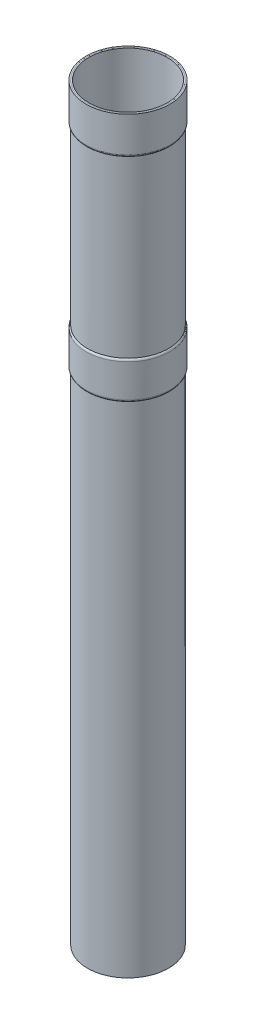
ISO-10303-21;
HEADER;
FILE_DESCRIPTION(('STEP AP214'),'2;1');
FILE_NAME('part.step','',(''),(''),'','','');
FILE_SCHEMA(('AUTOMOTIVE_DESIGN { 1 0 10303 214 1 1 1 1 }'));
ENDSEC;
DATA;
#1=APPLICATION_CONTEXT('core data for automotive mechanical design processes');
#2=APPLICATION_PROTOCOL_DEFINITION('international standard','automotive_design',2000,#1);
#3=PRODUCT_CONTEXT('',#1,'mechanical');
#4=PRODUCT('Part','Part','',(#3));
#5=PRODUCT_RELATED_PRODUCT_CATEGORY('part','',(#4));
#6=PRODUCT_DEFINITION_FORMATION('','',#4);
#7=PRODUCT_DEFINITION_CONTEXT('part definition',#1,'design');
#8=PRODUCT_DEFINITION('design','',#6,#7);
#9=PRODUCT_DEFINITION_SHAPE('','',#8);
#10=(LENGTH_UNIT() NAMED_UNIT(*) SI_UNIT(.MILLI.,.METRE.));
#11=(NAMED_UNIT(*) PLANE_ANGLE_UNIT() SI_UNIT($,.RADIAN.));
#12=(NAMED_UNIT(*) SI_UNIT($,.STERADIAN.) SOLID_ANGLE_UNIT());
#13=UNCERTAINTY_MEASURE_WITH_UNIT(LENGTH_MEASURE(1.E-05),#10,'distance_accuracy_value','');
#14=(GEOMETRIC_REPRESENTATION_CONTEXT(3) GLOBAL_UNCERTAINTY_ASSIGNED_CONTEXT((#13)) GLOBAL_UNIT_ASSIGNED_CONTEXT((#10,
#11,#12)) REPRESENTATION_CONTEXT('',''));
#15=CARTESIAN_POINT('',(0.,0.,0.));
#16=DIRECTION('',(0.,0.,1.));
#17=DIRECTION('',(1.,0.,0.));
#18=AXIS2_PLACEMENT_3D('',#15,#16,#17);
#19=CARTESIAN_POINT('',(0.,570.,0.));
#20=DIRECTION('',(0.,1.,0.));
#21=DIRECTION('',(0.,0.,1.));
#22=AXIS2_PLACEMENT_3D('',#19,#20,#21);
#23=CYLINDRICAL_SURFACE('',#22,33.5);
#24=CARTESIAN_POINT('',(0.,571.732050807569,0.));
#25=DIRECTION('',(0.,-1.,0.));
#26=DIRECTION('',(0.,0.,-1.));
#27=AXIS2_PLACEMENT_3D('',#24,#25,#26);
#28=CIRCLE('',#27,33.5);
#29=CARTESIAN_POINT('',(0.,571.732050807569,-33.5));
#30=VERTEX_POINT('',#29);
#31=EDGE_CURVE('E12',#30,#30,#28,.F.);
#32=ORIENTED_EDGE('',*,*,#31,.T.);
#33=EDGE_LOOP('',(#32));
#34=FACE_BOUND('',#33,.T.);
#35=CARTESIAN_POINT('',(0.,600.,0.));
#36=DIRECTION('',(0.,1.,0.));
#37=DIRECTION('',(0.,0.,1.));
#38=AXIS2_PLACEMENT_3D('',#35,#36,#37);
#39=CIRCLE('',#38,33.5);
#40=CARTESIAN_POINT('',(0.,600.,33.5));
#41=VERTEX_POINT('',#40);
#42=EDGE_CURVE('E57',#41,#41,#39,.T.);
#43=ORIENTED_EDGE('',*,*,#42,.F.);
#44=EDGE_LOOP('',(#43));
#45=FACE_BOUND('',#44,.T.);
#46=ADVANCED_FACE('F50',(#34,#45),#23,.T.);
#47=CARTESIAN_POINT('',(0.,600.,0.));
#48=DIRECTION('',(0.,1.,0.));
#49=DIRECTION('',(0.,0.,1.));
#50=AXIS2_PLACEMENT_3D('',#47,#48,#49);
#51=PLANE('',#50);
#52=CARTESIAN_POINT('',(0.,600.,0.));
#53=DIRECTION('',(0.,1.,0.));
#54=DIRECTION('',(0.,0.,1.));
#55=AXIS2_PLACEMENT_3D('',#52,#53,#54);
#56=CIRCLE('',#55,32.5);
#57=CARTESIAN_POINT('',(0.,600.,32.5));
#58=VERTEX_POINT('',#57);
#59=EDGE_CURVE('E65',#58,#58,#56,.T.);
#60=ORIENTED_EDGE('',*,*,#59,.F.);
#61=EDGE_LOOP('',(#60));
#62=FACE_BOUND('',#61,.T.);
#63=ORIENTED_EDGE('',*,*,#42,.T.);
#64=EDGE_LOOP('',(#63));
#65=FACE_BOUND('',#64,.T.);
#66=ADVANCED_FACE('F73',(#62,#65),#51,.T.);
#67=CARTESIAN_POINT('',(0.,570.,0.));
#68=DIRECTION('',(0.,1.,0.));
#69=DIRECTION('',(0.,0.,1.));
#70=AXIS2_PLACEMENT_3D('',#67,#68,#69);
#71=CYLINDRICAL_SURFACE('',#70,32.5);
#72=CARTESIAN_POINT('',(0.,570.,0.));
#73=DIRECTION('',(0.,1.,0.));
#74=DIRECTION('',(0.,0.,1.));
#75=AXIS2_PLACEMENT_3D('',#72,#73,#74);
#76=CIRCLE('',#75,32.5);
#77=CARTESIAN_POINT('',(0.,570.,32.5));
#78=VERTEX_POINT('',#77);
#79=EDGE_CURVE('E61',#78,#78,#76,.T.);
#80=ORIENTED_EDGE('',*,*,#79,.F.);
#81=EDGE_LOOP('',(#80));
#82=FACE_BOUND('',#81,.T.);
#83=ORIENTED_EDGE('',*,*,#59,.T.);
#84=EDGE_LOOP('',(#83));
#85=FACE_BOUND('',#84,.T.);
#86=ADVANCED_FACE('F71',(#82,#85),#71,.F.);
#87=CARTESIAN_POINT('',(0.,571.732050807569,0.));
#88=DIRECTION('',(0.,-1.,0.));
#89=DIRECTION('',(0.,0.,-1.));
#90=AXIS2_PLACEMENT_3D('',#87,#88,#89);
#91=TOROIDAL_SURFACE('',#90,31.5,2.);
#92=ORIENTED_EDGE('',*,*,#79,.T.);
#93=EDGE_LOOP('',(#92));
#94=FACE_BOUND('',#93,.T.);
#95=ORIENTED_EDGE('',*,*,#31,.F.);
#96=EDGE_LOOP('',(#95));
#97=FACE_BOUND('',#96,.T.);
#98=ADVANCED_FACE('F52',(#94,#97),#91,.T.);
#99=CLOSED_SHELL('',(#46,#66,#86,#98));
#100=MANIFOLD_SOLID_BREP('B2',#99);
#101=CARTESIAN_POINT('',(0.,0.,0.));
#102=DIRECTION('',(0.,1.,0.));
#103=DIRECTION('',(0.,0.,1.));
#104=AXIS2_PLACEMENT_3D('',#101,#102,#103);
#105=PLANE('',#104);
#106=CARTESIAN_POINT('',(0.,0.,0.));
#107=DIRECTION('',(0.,1.,0.));
#108=DIRECTION('',(0.,0.,1.));
#109=AXIS2_PLACEMENT_3D('',#106,#107,#108);
#110=CIRCLE('',#109,31.5);
#111=CARTESIAN_POINT('',(0.,0.,31.5));
#112=VERTEX_POINT('',#111);
#113=EDGE_CURVE('E132',#112,#112,#110,.T.);
#114=ORIENTED_EDGE('',*,*,#113,.T.);
#115=EDGE_LOOP('',(#114));
#116=FACE_BOUND('',#115,.T.);
#117=CARTESIAN_POINT('',(0.,0.,0.));
#118=DIRECTION('',(0.,-1.,0.));
#119=DIRECTION('',(0.,0.,-1.));
#120=AXIS2_PLACEMENT_3D('',#117,#118,#119);
#121=CIRCLE('',#120,32.5);
#122=CARTESIAN_POINT('',(0.,0.,-32.5));
#123=VERTEX_POINT('',#122);
#124=EDGE_CURVE('E138',#123,#123,#121,.T.);
#125=ORIENTED_EDGE('',*,*,#124,.T.);
#126=EDGE_LOOP('',(#125));
#127=FACE_BOUND('',#126,.T.);
#128=ADVANCED_FACE('F111',(#116,#127),#105,.F.);
#129=CARTESIAN_POINT('',(0.,430.,0.));
#130=DIRECTION('',(0.,-1.,0.));
#131=DIRECTION('',(0.,0.,-1.));
#132=AXIS2_PLACEMENT_3D('',#129,#130,#131);
#133=CYLINDRICAL_SURFACE('',#132,33.5);
#134=CARTESIAN_POINT('',(0.,428.267949192431,0.));
#135=DIRECTION('',(0.,1.,0.));
#136=DIRECTION('',(0.,0.,1.));
#137=AXIS2_PLACEMENT_3D('',#134,#135,#136);
#138=CIRCLE('',#137,33.5);
#139=CARTESIAN_POINT('',(0.,428.267949192431,33.5));
#140=VERTEX_POINT('',#139);
#141=EDGE_CURVE('E49',#140,#140,#138,.F.);
#142=ORIENTED_EDGE('',*,*,#141,.T.);
#143=EDGE_LOOP('',(#142));
#144=FACE_BOUND('',#143,.T.);
#145=CARTESIAN_POINT('',(0.,401.732050807569,0.));
#146=DIRECTION('',(0.,-1.,0.));
#147=DIRECTION('',(0.,0.,-1.));
#148=AXIS2_PLACEMENT_3D('',#145,#146,#147);
#149=CIRCLE('',#148,33.5);
#150=CARTESIAN_POINT('',(0.,401.732050807569,-33.5));
#151=VERTEX_POINT('',#150);
#152=EDGE_CURVE('E118',#151,#151,#149,.F.);
#153=ORIENTED_EDGE('',*,*,#152,.T.);
#154=EDGE_LOOP('',(#153));
#155=FACE_BOUND('',#154,.T.);
#156=ADVANCED_FACE('F159',(#144,#155),#133,.T.);
#157=CARTESIAN_POINT('',(0.,600.,0.));
#158=DIRECTION('',(0.,-1.,0.));
#159=DIRECTION('',(0.,0.,-1.));
#160=AXIS2_PLACEMENT_3D('',#157,#158,#159);
#161=CYLINDRICAL_SURFACE('',#160,32.5);
#162=CARTESIAN_POINT('',(0.,600.,0.));
#163=DIRECTION('',(0.,1.,0.));
#164=DIRECTION('',(0.,0.,1.));
#165=AXIS2_PLACEMENT_3D('',#162,#163,#164);
#166=CIRCLE('',#165,32.5);
#167=CARTESIAN_POINT('',(0.,600.,32.5));
#168=VERTEX_POINT('',#167);
#169=EDGE_CURVE('E126',#168,#168,#166,.T.);
#170=ORIENTED_EDGE('',*,*,#169,.F.);
#171=EDGE_LOOP('',(#170));
#172=FACE_BOUND('',#171,.T.);
#173=CARTESIAN_POINT('',(0.,430.,0.));
#174=DIRECTION('',(0.,-1.,0.));
#175=DIRECTION('',(0.,0.,-1.));
#176=AXIS2_PLACEMENT_3D('',#173,#174,#175);
#177=CIRCLE('',#176,32.5);
#178=CARTESIAN_POINT('',(0.,430.,-32.5));
#179=VERTEX_POINT('',#178);
#180=EDGE_CURVE('E122',#179,#179,#177,.T.);
#181=ORIENTED_EDGE('',*,*,#180,.F.);
#182=EDGE_LOOP('',(#181));
#183=FACE_BOUND('',#182,.T.);
#184=ADVANCED_FACE('F165',(#172,#183),#161,.T.);
#185=CARTESIAN_POINT('',(0.,600.,0.));
#186=DIRECTION('',(0.,1.,0.));
#187=DIRECTION('',(0.,0.,1.));
#188=AXIS2_PLACEMENT_3D('',#185,#186,#187);
#189=PLANE('',#188);
#190=ORIENTED_EDGE('',*,*,#169,.T.);
#191=EDGE_LOOP('',(#190));
#192=FACE_BOUND('',#191,.T.);
#193=CARTESIAN_POINT('',(0.,600.,0.));
#194=DIRECTION('',(0.,1.,0.));
#195=DIRECTION('',(0.,0.,1.));
#196=AXIS2_PLACEMENT_3D('',#193,#194,#195);
#197=CIRCLE('',#196,31.5);
#198=CARTESIAN_POINT('',(0.,600.,31.5));
#199=VERTEX_POINT('',#198);
#200=EDGE_CURVE('E131',#199,#199,#197,.T.);
#201=ORIENTED_EDGE('',*,*,#200,.F.);
#202=EDGE_LOOP('',(#201));
#203=FACE_BOUND('',#202,.T.);
#204=ADVANCED_FACE('F169',(#192,#203),#189,.T.);
#205=CARTESIAN_POINT('',(0.,600.,0.));
#206=DIRECTION('',(0.,-1.,0.));
#207=DIRECTION('',(0.,0.,-1.));
#208=AXIS2_PLACEMENT_3D('',#205,#206,#207);
#209=CYLINDRICAL_SURFACE('',#208,31.5);
#210=ORIENTED_EDGE('',*,*,#200,.T.);
#211=EDGE_LOOP('',(#210));
#212=FACE_BOUND('',#211,.T.);
#213=ORIENTED_EDGE('',*,*,#113,.F.);
#214=EDGE_LOOP('',(#213));
#215=FACE_BOUND('',#214,.T.);
#216=ADVANCED_FACE('F155',(#212,#215),#209,.F.);
#217=CARTESIAN_POINT('',(0.,400.,0.));
#218=DIRECTION('',(0.,-1.,0.));
#219=DIRECTION('',(0.,0.,-1.));
#220=AXIS2_PLACEMENT_3D('',#217,#218,#219);
#221=CYLINDRICAL_SURFACE('',#220,32.5);
#222=CARTESIAN_POINT('',(0.,400.,0.));
#223=DIRECTION('',(0.,-1.,0.));
#224=DIRECTION('',(0.,0.,-1.));
#225=AXIS2_PLACEMENT_3D('',#222,#223,#224);
#226=CIRCLE('',#225,32.5);
#227=CARTESIAN_POINT('',(0.,400.,-32.5));
#228=VERTEX_POINT('',#227);
#229=EDGE_CURVE('E135',#228,#228,#226,.T.);
#230=ORIENTED_EDGE('',*,*,#229,.T.);
#231=EDGE_LOOP('',(#230));
#232=FACE_BOUND('',#231,.T.);
#233=ORIENTED_EDGE('',*,*,#124,.F.);
#234=EDGE_LOOP('',(#233));
#235=FACE_BOUND('',#234,.T.);
#236=ADVANCED_FACE('F144',(#232,#235),#221,.T.);
#237=CARTESIAN_POINT('',(0.,401.732050807569,0.));
#238=DIRECTION('',(0.,-1.,0.));
#239=DIRECTION('',(0.,0.,-1.));
#240=AXIS2_PLACEMENT_3D('',#237,#238,#239);
#241=TOROIDAL_SURFACE('',#240,31.5,2.);
#242=ORIENTED_EDGE('',*,*,#152,.F.);
#243=EDGE_LOOP('',(#242));
#244=FACE_BOUND('',#243,.T.);
#245=ORIENTED_EDGE('',*,*,#229,.F.);
#246=EDGE_LOOP('',(#245));
#247=FACE_BOUND('',#246,.T.);
#248=ADVANCED_FACE('F147',(#244,#247),#241,.T.);
#249=CARTESIAN_POINT('',(0.,428.267949192431,0.));
#250=DIRECTION('',(0.,1.,0.));
#251=DIRECTION('',(0.,0.,1.));
#252=AXIS2_PLACEMENT_3D('',#249,#250,#251);
#253=TOROIDAL_SURFACE('',#252,31.5,2.);
#254=ORIENTED_EDGE('',*,*,#180,.T.);
#255=EDGE_LOOP('',(#254));
#256=FACE_BOUND('',#255,.T.);
#257=ORIENTED_EDGE('',*,*,#141,.F.);
#258=EDGE_LOOP('',(#257));
#259=FACE_BOUND('',#258,.T.);
#260=ADVANCED_FACE('F113',(#256,#259),#253,.T.);
#261=CLOSED_SHELL('',(#128,#156,#184,#204,#216,#236,#248,#260));
#262=MANIFOLD_SOLID_BREP('B7',#261);
#263=ADVANCED_BREP_SHAPE_REPRESENTATION('',(#18,#100,#262),#14);
#264=SHAPE_DEFINITION_REPRESENTATION(#9,#263);
ENDSEC;
END-ISO-10303-21;
